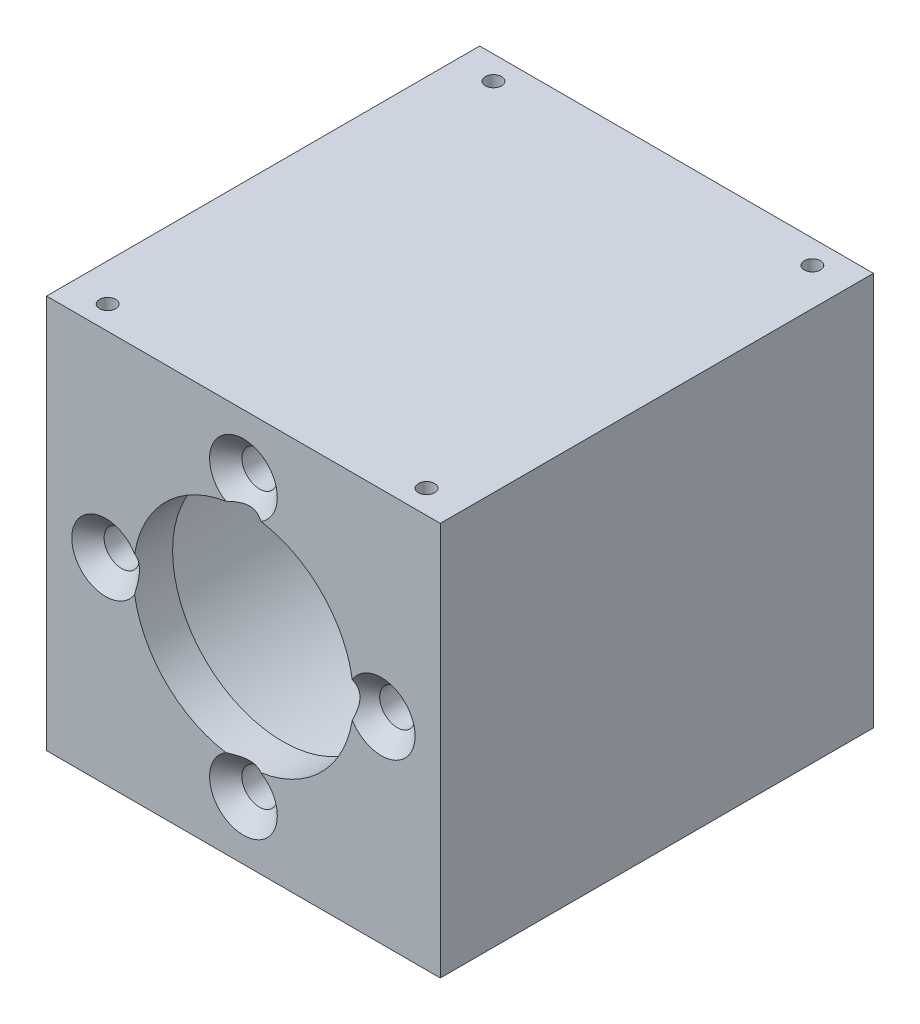
ISO-10303-21;
HEADER;
FILE_DESCRIPTION(('STEP AP214'),'2;1');
FILE_NAME('part.step','',(''),(''),'','','');
FILE_SCHEMA(('AUTOMOTIVE_DESIGN { 1 0 10303 214 1 1 1 1 }'));
ENDSEC;
DATA;
#1=APPLICATION_CONTEXT('core data for automotive mechanical design processes');
#2=APPLICATION_PROTOCOL_DEFINITION('international standard','automotive_design',2000,#1);
#3=PRODUCT_CONTEXT('',#1,'mechanical');
#4=PRODUCT('Part','Part','',(#3));
#5=PRODUCT_RELATED_PRODUCT_CATEGORY('part','',(#4));
#6=PRODUCT_DEFINITION_FORMATION('','',#4);
#7=PRODUCT_DEFINITION_CONTEXT('part definition',#1,'design');
#8=PRODUCT_DEFINITION('design','',#6,#7);
#9=PRODUCT_DEFINITION_SHAPE('','',#8);
#10=(LENGTH_UNIT() NAMED_UNIT(*) SI_UNIT(.MILLI.,.METRE.));
#11=(NAMED_UNIT(*) PLANE_ANGLE_UNIT() SI_UNIT($,.RADIAN.));
#12=(NAMED_UNIT(*) SI_UNIT($,.STERADIAN.) SOLID_ANGLE_UNIT());
#13=UNCERTAINTY_MEASURE_WITH_UNIT(LENGTH_MEASURE(1.E-05),#10,'distance_accuracy_value','');
#14=(GEOMETRIC_REPRESENTATION_CONTEXT(3) GLOBAL_UNCERTAINTY_ASSIGNED_CONTEXT((#13)) GLOBAL_UNIT_ASSIGNED_CONTEXT((#10,
#11,#12)) REPRESENTATION_CONTEXT('',''));
#15=CARTESIAN_POINT('',(0.,0.,0.));
#16=DIRECTION('',(0.,0.,1.));
#17=DIRECTION('',(1.,0.,0.));
#18=AXIS2_PLACEMENT_3D('',#15,#16,#17);
#19=CARTESIAN_POINT('',(0.,0.,27.5));
#20=DIRECTION('',(0.,0.,-1.));
#21=DIRECTION('',(-1.,0.,0.));
#22=AXIS2_PLACEMENT_3D('',#19,#20,#21);
#23=PLANE('',#22);
#24=DIRECTION('',(0.,1.,0.));
#25=VECTOR('',#24,1.);
#26=CARTESIAN_POINT('',(25.,-25.,27.5));
#27=LINE('',#26,#25);
#28=CARTESIAN_POINT('',(25.,-25.,27.5));
#29=VERTEX_POINT('',#28);
#30=CARTESIAN_POINT('',(25.,25.,27.5));
#31=VERTEX_POINT('',#30);
#32=EDGE_CURVE('E264',#29,#31,#27,.T.);
#33=ORIENTED_EDGE('',*,*,#32,.T.);
#34=DIRECTION('',(-1.,0.,0.));
#35=VECTOR('',#34,1.);
#36=CARTESIAN_POINT('',(-25.,25.,27.5));
#37=LINE('',#36,#35);
#38=CARTESIAN_POINT('',(-25.,25.,27.5));
#39=VERTEX_POINT('',#38);
#40=EDGE_CURVE('E267',#31,#39,#37,.T.);
#41=ORIENTED_EDGE('',*,*,#40,.T.);
#42=DIRECTION('',(0.,-1.,0.));
#43=VECTOR('',#42,1.);
#44=CARTESIAN_POINT('',(-25.,-25.,27.5));
#45=LINE('',#44,#43);
#46=CARTESIAN_POINT('',(-25.,-25.,27.5));
#47=VERTEX_POINT('',#46);
#48=EDGE_CURVE('E270',#39,#47,#45,.T.);
#49=ORIENTED_EDGE('',*,*,#48,.T.);
#50=DIRECTION('',(1.,0.,0.));
#51=VECTOR('',#50,1.);
#52=CARTESIAN_POINT('',(-25.,-25.,27.5));
#53=LINE('',#52,#51);
#54=EDGE_CURVE('E272',#47,#29,#53,.T.);
#55=ORIENTED_EDGE('',*,*,#54,.T.);
#56=EDGE_LOOP('',(#33,#41,#49,#55));
#57=FACE_BOUND('',#56,.T.);
#58=CARTESIAN_POINT('',(0.,17.5,27.5));
#59=DIRECTION('',(0.,0.,1.));
#60=DIRECTION('',(1.,0.,0.));
#61=AXIS2_PLACEMENT_3D('',#58,#59,#60);
#62=CIRCLE('',#61,4.3);
#63=CARTESIAN_POINT('',(2.22715383484878,13.8217142857143,27.5));
#64=VERTEX_POINT('',#63);
#65=CARTESIAN_POINT('',(-2.22715383484878,13.8217142857143,27.5));
#66=VERTEX_POINT('',#65);
#67=EDGE_CURVE('E91',#64,#66,#62,.T.);
#68=ORIENTED_EDGE('',*,*,#67,.F.);
#69=CARTESIAN_POINT('',(0.,0.,27.5));
#70=DIRECTION('',(0.,0.,1.));
#71=DIRECTION('',(1.,0.,0.));
#72=AXIS2_PLACEMENT_3D('',#69,#70,#71);
#73=CIRCLE('',#72,14.);
#74=CARTESIAN_POINT('',(13.8217142857143,2.22715383484877,27.5));
#75=VERTEX_POINT('',#74);
#76=EDGE_CURVE('E688',#75,#64,#73,.T.);
#77=ORIENTED_EDGE('',*,*,#76,.F.);
#78=CARTESIAN_POINT('',(17.5,0.,27.5));
#79=DIRECTION('',(0.,0.,1.));
#80=DIRECTION('',(1.,0.,0.));
#81=AXIS2_PLACEMENT_3D('',#78,#79,#80);
#82=CIRCLE('',#81,4.3);
#83=CARTESIAN_POINT('',(13.8217142857143,-2.22715383484878,27.5));
#84=VERTEX_POINT('',#83);
#85=EDGE_CURVE('E98',#84,#75,#82,.T.);
#86=ORIENTED_EDGE('',*,*,#85,.F.);
#87=CARTESIAN_POINT('',(2.22715383484878,-13.8217142857143,27.5));
#88=VERTEX_POINT('',#87);
#89=EDGE_CURVE('E262',#88,#84,#73,.T.);
#90=ORIENTED_EDGE('',*,*,#89,.F.);
#91=CARTESIAN_POINT('',(0.,-17.5,27.5));
#92=DIRECTION('',(0.,0.,1.));
#93=DIRECTION('',(1.,0.,0.));
#94=AXIS2_PLACEMENT_3D('',#91,#92,#93);
#95=CIRCLE('',#94,4.3);
#96=CARTESIAN_POINT('',(-2.22715383484878,-13.8217142857143,27.5));
#97=VERTEX_POINT('',#96);
#98=EDGE_CURVE('E211',#97,#88,#95,.T.);
#99=ORIENTED_EDGE('',*,*,#98,.F.);
#100=CARTESIAN_POINT('',(-13.8217142857143,-2.22715383484878,27.5));
#101=VERTEX_POINT('',#100);
#102=EDGE_CURVE('E258',#101,#97,#73,.T.);
#103=ORIENTED_EDGE('',*,*,#102,.F.);
#104=CARTESIAN_POINT('',(-17.5,0.,27.5));
#105=DIRECTION('',(0.,0.,1.));
#106=DIRECTION('',(1.,0.,0.));
#107=AXIS2_PLACEMENT_3D('',#104,#105,#106);
#108=CIRCLE('',#107,4.3);
#109=CARTESIAN_POINT('',(-13.8217142857143,2.22715383484878,27.5));
#110=VERTEX_POINT('',#109);
#111=EDGE_CURVE('E219',#110,#101,#108,.T.);
#112=ORIENTED_EDGE('',*,*,#111,.F.);
#113=EDGE_CURVE('E263',#66,#110,#73,.T.);
#114=ORIENTED_EDGE('',*,*,#113,.F.);
#115=EDGE_LOOP('',(#68,#77,#86,#90,#99,#103,#112,#114));
#116=FACE_BOUND('',#115,.T.);
#117=ADVANCED_FACE('F73',(#57,#116),#23,.F.);
#118=CARTESIAN_POINT('',(0.,0.,27.5));
#119=DIRECTION('',(0.,0.,-1.));
#120=DIRECTION('',(-1.,0.,0.));
#121=AXIS2_PLACEMENT_3D('',#118,#119,#120);
#122=CYLINDRICAL_SURFACE('',#121,14.);
#123=CARTESIAN_POINT('',(-2.22745880103771,13.8216651417143,27.5002));
#124=CARTESIAN_POINT('',(-2.17450267195315,13.8301988409129,27.4654729911263));
#125=CARTESIAN_POINT('',(-2.12113362184145,13.838487981573,27.4313171313179));
#126=CARTESIAN_POINT('',(-2.01348576873865,13.854560288671,27.3643139397824));
#127=CARTESIAN_POINT('',(-1.95920672173003,13.8623433165731,27.3314669672753));
#128=CARTESIAN_POINT('',(-1.79444409633277,13.884966802318,27.2348865725409));
#129=CARTESIAN_POINT('',(-1.68249632642925,13.8990067709712,27.1734201185765));
#130=CARTESIAN_POINT('',(-1.45191250125242,13.9250024136204,27.0572477027898));
#131=CARTESIAN_POINT('',(-1.33318581836051,13.9369087329985,27.0027086972848));
#132=CARTESIAN_POINT('',(-1.09115905950614,13.957939394927,26.9046630812547));
#133=CARTESIAN_POINT('',(-0.96786790802613,13.967068874707,26.861136123558));
#134=CARTESIAN_POINT('',(-0.762931476370636,13.9794236389379,26.8014873300983));
#135=CARTESIAN_POINT('',(-0.682561875823928,13.9835868705551,26.7811661442487));
#136=CARTESIAN_POINT('',(-0.520386819044165,13.9905603807477,26.7469256346802));
#137=CARTESIAN_POINT('',(-0.438581311626124,13.9933706109915,26.7330065396562));
#138=CARTESIAN_POINT('',(-0.274831076277266,13.9975394032496,26.7122967881537));
#139=CARTESIAN_POINT('',(-0.192895358088177,13.9989117514227,26.7054384457219));
#140=CARTESIAN_POINT('',(-0.0287273210955786,14.0002111524851,26.6989456618487));
#141=CARTESIAN_POINT('',(0.0535049815008426,14.000138283188,26.6993108314781));
#142=CARTESIAN_POINT('',(0.217607134094292,13.9985491542739,26.7072489076269));
#143=CARTESIAN_POINT('',(0.299476974674637,13.9970328573755,26.7148220003155));
#144=CARTESIAN_POINT('',(0.462237666722219,13.9926043465483,26.7368016229928));
#145=CARTESIAN_POINT('',(0.543128432987735,13.9896920120151,26.7512087433746));
#146=CARTESIAN_POINT('',(0.785113096769745,13.9789044903567,26.8041088517993));
#147=CARTESIAN_POINT('',(0.944071029492941,13.9689947124549,26.8521936803851));
#148=CARTESIAN_POINT('',(1.20015087805801,13.9488342648143,26.9472918899536));
#149=CARTESIAN_POINT('',(1.29953956583022,13.9399025943491,26.9888537275451));
#150=CARTESIAN_POINT('',(1.49525723898197,13.9202680942927,27.0784829548433));
#151=CARTESIAN_POINT('',(1.59158391043927,13.9095639615021,27.1265551264888));
#152=CARTESIAN_POINT('',(1.77935250765603,13.8867809536507,27.2267999762324));
#153=CARTESIAN_POINT('',(1.87085376850834,13.8747341587205,27.2788704005702));
#154=CARTESIAN_POINT('',(2.05109927537821,13.8492317295261,27.3868653601595));
#155=CARTESIAN_POINT('',(2.13984882602945,13.8357790568541,27.4427817119294));
#156=CARTESIAN_POINT('',(2.22745880103768,13.8216651417143,27.5002));
#157=B_SPLINE_CURVE_WITH_KNOTS('',3,(#123,#124,#125,#126,#127,#128,#129,#130,#131,#132,#133,
#134,#135,#136,#137,#138,#139,#140,#141,#142,#143,#144,#145,#146,#147,#148,#149,#150,#151,#152,
#153,#154,#155,#156),.UNSPECIFIED.,.F.,.F.,(4,2,2,2,2,2,2,2,2,2,2,2,2,2,2,2,4),(0.,
0.191689711953625,0.383431675211452,0.768589902940578,1.16174888862305,1.55417603224038,
1.80295482789635,2.05174250971589,2.29812240118427,2.54448902707525,2.7908620163931,
3.03725629380246,3.5343448819431,3.85842911793801,4.18275270299738,4.50053525074928,
4.81766136649085),.UNSPECIFIED.);
#158=EDGE_CURVE('E15',#66,#64,#157,.T.);
#159=ORIENTED_EDGE('',*,*,#158,.F.);
#160=ORIENTED_EDGE('',*,*,#113,.T.);
#161=CARTESIAN_POINT('',(-13.8216651417143,-2.22745880103771,27.5002));
#162=CARTESIAN_POINT('',(-13.8301988409129,-2.17450267195315,27.4654729911263));
#163=CARTESIAN_POINT('',(-13.838487981573,-2.12113362184145,27.4313171313179));
#164=CARTESIAN_POINT('',(-13.854560288671,-2.01348576873865,27.3643139397824));
#165=CARTESIAN_POINT('',(-13.8623433165731,-1.95920672173003,27.3314669672753));
#166=CARTESIAN_POINT('',(-13.884966802318,-1.79444409633277,27.2348865725409));
#167=CARTESIAN_POINT('',(-13.8990067709712,-1.68249632642925,27.1734201185765));
#168=CARTESIAN_POINT('',(-13.9250024136204,-1.45191250125242,27.0572477027898));
#169=CARTESIAN_POINT('',(-13.9369087329985,-1.33318581836051,27.0027086972848));
#170=CARTESIAN_POINT('',(-13.957939394927,-1.09115905950614,26.9046630812547));
#171=CARTESIAN_POINT('',(-13.967068874707,-0.967867908026133,26.861136123558));
#172=CARTESIAN_POINT('',(-13.9794236389379,-0.762931476370638,26.8014873300983));
#173=CARTESIAN_POINT('',(-13.9835868705551,-0.682561875823931,26.7811661442487));
#174=CARTESIAN_POINT('',(-13.9905603807477,-0.520386819044167,26.7469256346802));
#175=CARTESIAN_POINT('',(-13.9933706109915,-0.438581311626127,26.7330065396562));
#176=CARTESIAN_POINT('',(-13.9975394032496,-0.274831076277269,26.7122967881537));
#177=CARTESIAN_POINT('',(-13.9989117514227,-0.19289535808818,26.7054384457219));
#178=CARTESIAN_POINT('',(-14.0002111524851,-0.0287273210955819,26.6989456618487));
#179=CARTESIAN_POINT('',(-14.000138283188,0.0535049815008392,26.6993108314781));
#180=CARTESIAN_POINT('',(-13.9985491542739,0.217607134094288,26.7072489076269));
#181=CARTESIAN_POINT('',(-13.9970328573755,0.299476974674633,26.7148220003155));
#182=CARTESIAN_POINT('',(-13.9926043465483,0.462237666722216,26.7368016229928));
#183=CARTESIAN_POINT('',(-13.9896920120151,0.543128432987732,26.7512087433746));
#184=CARTESIAN_POINT('',(-13.9789044903567,0.785113096769742,26.8041088517993));
#185=CARTESIAN_POINT('',(-13.9689947124549,0.944071029492938,26.8521936803851));
#186=CARTESIAN_POINT('',(-13.9488342648143,1.20015087805801,26.9472918899536));
#187=CARTESIAN_POINT('',(-13.9399025943491,1.29953956583022,26.9888537275451));
#188=CARTESIAN_POINT('',(-13.9202680942927,1.49525723898197,27.0784829548433));
#189=CARTESIAN_POINT('',(-13.9095639615021,1.59158391043927,27.1265551264888));
#190=CARTESIAN_POINT('',(-13.8867809536507,1.77935250765603,27.2267999762324));
#191=CARTESIAN_POINT('',(-13.8747341587205,1.87085376850834,27.2788704005702));
#192=CARTESIAN_POINT('',(-13.8492317295261,2.05109927537822,27.3868653601595));
#193=CARTESIAN_POINT('',(-13.8357790568541,2.13984882602946,27.4427817119294));
#194=CARTESIAN_POINT('',(-13.8216651417143,2.22745880103768,27.5002));
#195=B_SPLINE_CURVE_WITH_KNOTS('',3,(#161,#162,#163,#164,#165,#166,#167,#168,#169,#170,#171,
#172,#173,#174,#175,#176,#177,#178,#179,#180,#181,#182,#183,#184,#185,#186,#187,#188,#189,#190,
#191,#192,#193,#194),.UNSPECIFIED.,.F.,.F.,(4,2,2,2,2,2,2,2,2,2,2,2,2,2,2,2,4),(0.,
0.191689711953621,0.383431675211451,0.768589902940576,1.16174888862304,1.55417603224037,
1.80295482789634,2.05174250971588,2.29812240118427,2.54448902707525,2.79086201639309,
3.03725629380245,3.53434488194309,3.85842911793801,4.18275270299738,4.50053525074928,
4.81766136649085),.UNSPECIFIED.);
#196=EDGE_CURVE('E293',#101,#110,#195,.T.);
#197=ORIENTED_EDGE('',*,*,#196,.F.);
#198=ORIENTED_EDGE('',*,*,#102,.T.);
#199=CARTESIAN_POINT('',(2.22745880103768,-13.8216651417143,27.5002));
#200=CARTESIAN_POINT('',(2.17450267195312,-13.8301988409129,27.4654729911263));
#201=CARTESIAN_POINT('',(2.12113362184142,-13.8384879815731,27.4313171313178));
#202=CARTESIAN_POINT('',(2.01348576873862,-13.854560288671,27.3643139397824));
#203=CARTESIAN_POINT('',(1.95920672173,-13.8623433165731,27.3314669672753));
#204=CARTESIAN_POINT('',(1.79444409633274,-13.884966802318,27.2348865725409));
#205=CARTESIAN_POINT('',(1.68249632642922,-13.8990067709712,27.1734201185764));
#206=CARTESIAN_POINT('',(1.45191250125239,-13.9250024136204,27.0572477027898));
#207=CARTESIAN_POINT('',(1.33318581836048,-13.9369087329985,27.0027086972848));
#208=CARTESIAN_POINT('',(1.09115905950611,-13.957939394927,26.9046630812546));
#209=CARTESIAN_POINT('',(0.967867908026108,-13.967068874707,26.861136123558));
#210=CARTESIAN_POINT('',(0.762931476370616,-13.9794236389379,26.8014873300983));
#211=CARTESIAN_POINT('',(0.682561875823909,-13.9835868705551,26.7811661442487));
#212=CARTESIAN_POINT('',(0.520386819044145,-13.9905603807477,26.7469256346802));
#213=CARTESIAN_POINT('',(0.438581311626104,-13.9933706109915,26.7330065396562));
#214=CARTESIAN_POINT('',(0.274831076277246,-13.9975394032496,26.7122967881537));
#215=CARTESIAN_POINT('',(0.192895358088158,-13.9989117514227,26.7054384457219));
#216=CARTESIAN_POINT('',(0.02872732109556,-14.0002111524851,26.6989456618487));
#217=CARTESIAN_POINT('',(-0.0535049815008611,-14.000138283188,26.6993108314781));
#218=CARTESIAN_POINT('',(-0.21760713409431,-13.9985491542739,26.7072489076269));
#219=CARTESIAN_POINT('',(-0.299476974674654,-13.9970328573755,26.7148220003155));
#220=CARTESIAN_POINT('',(-0.462237666722236,-13.9926043465483,26.7368016229928));
#221=CARTESIAN_POINT('',(-0.543128432987752,-13.9896920120151,26.7512087433746));
#222=CARTESIAN_POINT('',(-0.785113096769761,-13.9789044903567,26.8041088517993));
#223=CARTESIAN_POINT('',(-0.944071029492957,-13.9689947124549,26.8521936803851));
#224=CARTESIAN_POINT('',(-1.20015087805803,-13.9488342648143,26.9472918899536));
#225=CARTESIAN_POINT('',(-1.29953956583023,-13.9399025943491,26.9888537275451));
#226=CARTESIAN_POINT('',(-1.49525723898199,-13.9202680942927,27.0784829548433));
#227=CARTESIAN_POINT('',(-1.59158391043929,-13.9095639615021,27.1265551264888));
#228=CARTESIAN_POINT('',(-1.77935250765605,-13.8867809536507,27.2267999762324));
#229=CARTESIAN_POINT('',(-1.87085376850836,-13.8747341587205,27.2788704005703));
#230=CARTESIAN_POINT('',(-2.05109927537824,-13.8492317295261,27.3868653601595));
#231=CARTESIAN_POINT('',(-2.13984882602948,-13.8357790568541,27.4427817119294));
#232=CARTESIAN_POINT('',(-2.2274588010377,-13.8216651417143,27.5002));
#233=B_SPLINE_CURVE_WITH_KNOTS('',3,(#199,#200,#201,#202,#203,#204,#205,#206,#207,#208,#209,
#210,#211,#212,#213,#214,#215,#216,#217,#218,#219,#220,#221,#222,#223,#224,#225,#226,#227,#228,
#229,#230,#231,#232),.UNSPECIFIED.,.F.,.F.,(4,2,2,2,2,2,2,2,2,2,2,2,2,2,2,2,4),(0.,
0.191689711953622,0.383431675211452,0.768589902940573,1.16174888862304,1.55417603224036,
1.80295482789633,2.05174250971587,2.29812240118426,2.54448902707523,2.79086201639308,
3.03725629380244,3.53434488194308,3.85842911793799,4.18275270299737,4.50053525074928,
4.81766136649085),.UNSPECIFIED.);
#234=EDGE_CURVE('E302',#88,#97,#233,.T.);
#235=ORIENTED_EDGE('',*,*,#234,.F.);
#236=ORIENTED_EDGE('',*,*,#89,.T.);
#237=CARTESIAN_POINT('',(13.8216651417143,2.22745880103768,27.5002));
#238=CARTESIAN_POINT('',(13.8301988409129,2.17450267195312,27.4654729911263));
#239=CARTESIAN_POINT('',(13.8384879815731,2.12113362184142,27.4313171313178));
#240=CARTESIAN_POINT('',(13.854560288671,2.01348576873862,27.3643139397824));
#241=CARTESIAN_POINT('',(13.8623433165731,1.95920672173,27.3314669672753));
#242=CARTESIAN_POINT('',(13.884966802318,1.79444409633274,27.2348865725409));
#243=CARTESIAN_POINT('',(13.8990067709712,1.68249632642922,27.1734201185764));
#244=CARTESIAN_POINT('',(13.9250024136204,1.4519125012524,27.0572477027898));
#245=CARTESIAN_POINT('',(13.9369087329985,1.33318581836049,27.0027086972848));
#246=CARTESIAN_POINT('',(13.957939394927,1.09115905950611,26.9046630812547));
#247=CARTESIAN_POINT('',(13.967068874707,0.96786790802611,26.861136123558));
#248=CARTESIAN_POINT('',(13.9794236389379,0.762931476370618,26.8014873300983));
#249=CARTESIAN_POINT('',(13.9835868705551,0.68256187582391,26.7811661442487));
#250=CARTESIAN_POINT('',(13.9905603807477,0.520386819044147,26.7469256346802));
#251=CARTESIAN_POINT('',(13.9933706109915,0.438581311626107,26.7330065396562));
#252=CARTESIAN_POINT('',(13.9975394032496,0.274831076277249,26.7122967881537));
#253=CARTESIAN_POINT('',(13.9989117514227,0.19289535808816,26.7054384457219));
#254=CARTESIAN_POINT('',(14.0002111524851,0.028727321095563,26.6989456618487));
#255=CARTESIAN_POINT('',(14.000138283188,-0.0535049815008578,26.6993108314781));
#256=CARTESIAN_POINT('',(13.9985491542739,-0.217607134094306,26.7072489076269));
#257=CARTESIAN_POINT('',(13.9970328573755,-0.299476974674651,26.7148220003155));
#258=CARTESIAN_POINT('',(13.9926043465483,-0.462237666722232,26.7368016229928));
#259=CARTESIAN_POINT('',(13.9896920120151,-0.543128432987747,26.7512087433746));
#260=CARTESIAN_POINT('',(13.9789044903567,-0.785113096769756,26.8041088517993));
#261=CARTESIAN_POINT('',(13.9689947124549,-0.944071029492952,26.8521936803851));
#262=CARTESIAN_POINT('',(13.9488342648143,-1.20015087805802,26.9472918899536));
#263=CARTESIAN_POINT('',(13.9399025943491,-1.29953956583023,26.9888537275451));
#264=CARTESIAN_POINT('',(13.9202680942927,-1.49525723898199,27.0784829548433));
#265=CARTESIAN_POINT('',(13.9095639615021,-1.59158391043929,27.1265551264888));
#266=CARTESIAN_POINT('',(13.8867809536507,-1.77935250765605,27.2267999762324));
#267=CARTESIAN_POINT('',(13.8747341587205,-1.87085376850836,27.2788704005703));
#268=CARTESIAN_POINT('',(13.8492317295261,-2.05109927537824,27.3868653601595));
#269=CARTESIAN_POINT('',(13.8357790568541,-2.13984882602948,27.4427817119294));
#270=CARTESIAN_POINT('',(13.8216651417143,-2.2274588010377,27.5002));
#271=B_SPLINE_CURVE_WITH_KNOTS('',3,(#237,#238,#239,#240,#241,#242,#243,#244,#245,#246,#247,
#248,#249,#250,#251,#252,#253,#254,#255,#256,#257,#258,#259,#260,#261,#262,#263,#264,#265,#266,
#267,#268,#269,#270),.UNSPECIFIED.,.F.,.F.,(4,2,2,2,2,2,2,2,2,2,2,2,2,2,2,2,4),(0.,
0.19168971195362,0.383431675211449,0.768589902940568,1.16174888862303,1.55417603224036,
1.80295482789633,2.05174250971587,2.29812240118425,2.54448902707523,2.79086201639307,
3.03725629380243,3.53434488194307,3.85842911793799,4.18275270299736,4.50053525074927,
4.81766136649085),.UNSPECIFIED.);
#272=EDGE_CURVE('E86',#75,#84,#271,.T.);
#273=ORIENTED_EDGE('',*,*,#272,.F.);
#274=ORIENTED_EDGE('',*,*,#76,.T.);
#275=EDGE_LOOP('',(#159,#160,#197,#198,#235,#236,#273,#274));
#276=FACE_BOUND('',#275,.T.);
#277=CARTESIAN_POINT('',(0.,0.,22.5));
#278=DIRECTION('',(0.,0.,-1.));
#279=DIRECTION('',(-1.,0.,0.));
#280=AXIS2_PLACEMENT_3D('',#277,#278,#279);
#281=CIRCLE('',#280,14.);
#282=CARTESIAN_POINT('',(-14.,0.,22.5));
#283=VERTEX_POINT('',#282);
#284=EDGE_CURVE('E257',#283,#283,#281,.T.);
#285=ORIENTED_EDGE('',*,*,#284,.T.);
#286=EDGE_LOOP('',(#285));
#287=FACE_BOUND('',#286,.T.);
#288=ADVANCED_FACE('F307',(#276,#287),#122,.F.);
#289=CARTESIAN_POINT('',(0.,0.,-27.5));
#290=DIRECTION('',(0.,0.,-1.));
#291=DIRECTION('',(-1.,0.,0.));
#292=AXIS2_PLACEMENT_3D('',#289,#290,#291);
#293=PLANE('',#292);
#294=CARTESIAN_POINT('',(0.,0.,-27.5));
#295=DIRECTION('',(0.,0.,-1.));
#296=DIRECTION('',(-1.,0.,0.));
#297=AXIS2_PLACEMENT_3D('',#294,#295,#296);
#298=CIRCLE('',#297,21.);
#299=CARTESIAN_POINT('',(-21.,0.,-27.5));
#300=VERTEX_POINT('',#299);
#301=EDGE_CURVE('E251',#300,#300,#298,.T.);
#302=ORIENTED_EDGE('',*,*,#301,.F.);
#303=EDGE_LOOP('',(#302));
#304=FACE_BOUND('',#303,.T.);
#305=DIRECTION('',(0.,1.,0.));
#306=VECTOR('',#305,1.);
#307=CARTESIAN_POINT('',(25.,-25.,-27.5));
#308=LINE('',#307,#306);
#309=CARTESIAN_POINT('',(25.,-25.,-27.5));
#310=VERTEX_POINT('',#309);
#311=CARTESIAN_POINT('',(25.,25.,-27.5));
#312=VERTEX_POINT('',#311);
#313=EDGE_CURVE('E261',#310,#312,#308,.T.);
#314=ORIENTED_EDGE('',*,*,#313,.F.);
#315=DIRECTION('',(1.,0.,0.));
#316=VECTOR('',#315,1.);
#317=CARTESIAN_POINT('',(-25.,-25.,-27.5));
#318=LINE('',#317,#316);
#319=CARTESIAN_POINT('',(-25.,-25.,-27.5));
#320=VERTEX_POINT('',#319);
#321=EDGE_CURVE('E268',#320,#310,#318,.T.);
#322=ORIENTED_EDGE('',*,*,#321,.F.);
#323=DIRECTION('',(0.,-1.,0.));
#324=VECTOR('',#323,1.);
#325=CARTESIAN_POINT('',(-25.,-25.,-27.5));
#326=LINE('',#325,#324);
#327=CARTESIAN_POINT('',(-25.,25.,-27.5));
#328=VERTEX_POINT('',#327);
#329=EDGE_CURVE('E279',#328,#320,#326,.T.);
#330=ORIENTED_EDGE('',*,*,#329,.F.);
#331=DIRECTION('',(-1.,0.,0.));
#332=VECTOR('',#331,1.);
#333=CARTESIAN_POINT('',(-25.,25.,-27.5));
#334=LINE('',#333,#332);
#335=EDGE_CURVE('E277',#312,#328,#334,.T.);
#336=ORIENTED_EDGE('',*,*,#335,.F.);
#337=EDGE_LOOP('',(#314,#322,#330,#336));
#338=FACE_BOUND('',#337,.T.);
#339=ADVANCED_FACE('F373',(#304,#338),#293,.T.);
#340=CARTESIAN_POINT('',(25.,-25.,27.5));
#341=DIRECTION('',(-1.,0.,0.));
#342=DIRECTION('',(0.,0.,1.));
#343=AXIS2_PLACEMENT_3D('',#340,#341,#342);
#344=PLANE('',#343);
#345=ORIENTED_EDGE('',*,*,#313,.T.);
#346=DIRECTION('',(0.,0.,-1.));
#347=VECTOR('',#346,1.);
#348=CARTESIAN_POINT('',(25.,25.,27.5));
#349=LINE('',#348,#347);
#350=EDGE_CURVE('E290',#31,#312,#349,.T.);
#351=ORIENTED_EDGE('',*,*,#350,.F.);
#352=ORIENTED_EDGE('',*,*,#32,.F.);
#353=DIRECTION('',(0.,0.,-1.));
#354=VECTOR('',#353,1.);
#355=CARTESIAN_POINT('',(25.,-25.,27.5));
#356=LINE('',#355,#354);
#357=EDGE_CURVE('E274',#29,#310,#356,.T.);
#358=ORIENTED_EDGE('',*,*,#357,.T.);
#359=EDGE_LOOP('',(#345,#351,#352,#358));
#360=FACE_BOUND('',#359,.T.);
#361=ADVANCED_FACE('F75',(#360),#344,.F.);
#362=CARTESIAN_POINT('',(-25.,25.,27.5));
#363=DIRECTION('',(0.,-1.,0.));
#364=DIRECTION('',(0.,0.,-1.));
#365=AXIS2_PLACEMENT_3D('',#362,#363,#364);
#366=PLANE('',#365);
#367=CARTESIAN_POINT('',(20.25,25.,-24.5));
#368=DIRECTION('',(0.,1.,0.));
#369=DIRECTION('',(0.,0.,1.));
#370=AXIS2_PLACEMENT_3D('',#367,#368,#369);
#371=CIRCLE('',#370,1.02499999999999);
#372=CARTESIAN_POINT('',(20.25,25.,-23.475));
#373=VERTEX_POINT('',#372);
#374=EDGE_CURVE('E227',#373,#373,#371,.T.);
#375=ORIENTED_EDGE('',*,*,#374,.F.);
#376=EDGE_LOOP('',(#375));
#377=FACE_BOUND('',#376,.T.);
#378=CARTESIAN_POINT('',(-20.25,25.,24.5));
#379=DIRECTION('',(0.,1.,0.));
#380=DIRECTION('',(0.,0.,1.));
#381=AXIS2_PLACEMENT_3D('',#378,#379,#380);
#382=CIRCLE('',#381,1.02499999999999);
#383=CARTESIAN_POINT('',(-20.25,25.,25.525));
#384=VERTEX_POINT('',#383);
#385=EDGE_CURVE('E233',#384,#384,#382,.T.);
#386=ORIENTED_EDGE('',*,*,#385,.F.);
#387=EDGE_LOOP('',(#386));
#388=FACE_BOUND('',#387,.T.);
#389=CARTESIAN_POINT('',(-20.25,25.,-24.5));
#390=DIRECTION('',(0.,1.,0.));
#391=DIRECTION('',(0.,0.,1.));
#392=AXIS2_PLACEMENT_3D('',#389,#390,#391);
#393=CIRCLE('',#392,1.02499999999999);
#394=CARTESIAN_POINT('',(-20.25,25.,-23.475));
#395=VERTEX_POINT('',#394);
#396=EDGE_CURVE('E239',#395,#395,#393,.T.);
#397=ORIENTED_EDGE('',*,*,#396,.F.);
#398=EDGE_LOOP('',(#397));
#399=FACE_BOUND('',#398,.T.);
#400=CARTESIAN_POINT('',(20.25,25.,24.5));
#401=DIRECTION('',(0.,1.,0.));
#402=DIRECTION('',(0.,0.,1.));
#403=AXIS2_PLACEMENT_3D('',#400,#401,#402);
#404=CIRCLE('',#403,1.02499999999999);
#405=CARTESIAN_POINT('',(20.25,25.,25.525));
#406=VERTEX_POINT('',#405);
#407=EDGE_CURVE('E245',#406,#406,#404,.T.);
#408=ORIENTED_EDGE('',*,*,#407,.F.);
#409=EDGE_LOOP('',(#408));
#410=FACE_BOUND('',#409,.T.);
#411=ORIENTED_EDGE('',*,*,#335,.T.);
#412=DIRECTION('',(0.,0.,-1.));
#413=VECTOR('',#412,1.);
#414=CARTESIAN_POINT('',(-25.,25.,27.5));
#415=LINE('',#414,#413);
#416=EDGE_CURVE('E287',#39,#328,#415,.T.);
#417=ORIENTED_EDGE('',*,*,#416,.F.);
#418=ORIENTED_EDGE('',*,*,#40,.F.);
#419=ORIENTED_EDGE('',*,*,#350,.T.);
#420=EDGE_LOOP('',(#411,#417,#418,#419));
#421=FACE_BOUND('',#420,.T.);
#422=ADVANCED_FACE('F381',(#377,#388,#399,#410,#421),#366,.F.);
#423=CARTESIAN_POINT('',(-25.,-25.,27.5));
#424=DIRECTION('',(1.,0.,0.));
#425=DIRECTION('',(0.,0.,-1.));
#426=AXIS2_PLACEMENT_3D('',#423,#424,#425);
#427=PLANE('',#426);
#428=ORIENTED_EDGE('',*,*,#329,.T.);
#429=DIRECTION('',(0.,0.,-1.));
#430=VECTOR('',#429,1.);
#431=CARTESIAN_POINT('',(-25.,-25.,27.5));
#432=LINE('',#431,#430);
#433=EDGE_CURVE('E284',#47,#320,#432,.T.);
#434=ORIENTED_EDGE('',*,*,#433,.F.);
#435=ORIENTED_EDGE('',*,*,#48,.F.);
#436=ORIENTED_EDGE('',*,*,#416,.T.);
#437=EDGE_LOOP('',(#428,#434,#435,#436));
#438=FACE_BOUND('',#437,.T.);
#439=ADVANCED_FACE('F364',(#438),#427,.F.);
#440=CARTESIAN_POINT('',(-25.,-25.,27.5));
#441=DIRECTION('',(0.,1.,0.));
#442=DIRECTION('',(0.,0.,1.));
#443=AXIS2_PLACEMENT_3D('',#440,#441,#442);
#444=PLANE('',#443);
#445=CARTESIAN_POINT('',(-21.,-25.,23.5));
#446=DIRECTION('',(0.,-1.,0.));
#447=DIRECTION('',(0.,0.,-1.));
#448=AXIS2_PLACEMENT_3D('',#445,#446,#447);
#449=CIRCLE('',#448,1.64999999999999);
#450=CARTESIAN_POINT('',(-21.,-25.,21.85));
#451=VERTEX_POINT('',#450);
#452=EDGE_CURVE('E175',#451,#451,#449,.T.);
#453=ORIENTED_EDGE('',*,*,#452,.F.);
#454=EDGE_LOOP('',(#453));
#455=FACE_BOUND('',#454,.T.);
#456=CARTESIAN_POINT('',(21.,-25.,-23.5));
#457=DIRECTION('',(0.,-1.,0.));
#458=DIRECTION('',(0.,0.,-1.));
#459=AXIS2_PLACEMENT_3D('',#456,#457,#458);
#460=CIRCLE('',#459,1.64999999999999);
#461=CARTESIAN_POINT('',(21.,-25.,-25.15));
#462=VERTEX_POINT('',#461);
#463=EDGE_CURVE('E174',#462,#462,#460,.T.);
#464=ORIENTED_EDGE('',*,*,#463,.F.);
#465=EDGE_LOOP('',(#464));
#466=FACE_BOUND('',#465,.T.);
#467=CARTESIAN_POINT('',(-21.,-25.,-23.5));
#468=DIRECTION('',(0.,-1.,0.));
#469=DIRECTION('',(0.,0.,-1.));
#470=AXIS2_PLACEMENT_3D('',#467,#468,#469);
#471=CIRCLE('',#470,1.64999999999999);
#472=CARTESIAN_POINT('',(-21.,-25.,-25.15));
#473=VERTEX_POINT('',#472);
#474=EDGE_CURVE('E185',#473,#473,#471,.T.);
#475=ORIENTED_EDGE('',*,*,#474,.F.);
#476=EDGE_LOOP('',(#475));
#477=FACE_BOUND('',#476,.T.);
#478=CARTESIAN_POINT('',(21.,-25.,23.5));
#479=DIRECTION('',(0.,-1.,0.));
#480=DIRECTION('',(0.,0.,-1.));
#481=AXIS2_PLACEMENT_3D('',#478,#479,#480);
#482=CIRCLE('',#481,1.64999999999999);
#483=CARTESIAN_POINT('',(21.,-25.,21.85));
#484=VERTEX_POINT('',#483);
#485=EDGE_CURVE('E191',#484,#484,#482,.T.);
#486=ORIENTED_EDGE('',*,*,#485,.F.);
#487=EDGE_LOOP('',(#486));
#488=FACE_BOUND('',#487,.T.);
#489=ORIENTED_EDGE('',*,*,#321,.T.);
#490=ORIENTED_EDGE('',*,*,#357,.F.);
#491=ORIENTED_EDGE('',*,*,#54,.F.);
#492=ORIENTED_EDGE('',*,*,#433,.T.);
#493=EDGE_LOOP('',(#489,#490,#491,#492));
#494=FACE_BOUND('',#493,.T.);
#495=ADVANCED_FACE('F359',(#455,#466,#477,#488,#494),#444,.F.);
#496=CARTESIAN_POINT('',(0.,0.,86.89696961967));
#497=DIRECTION('',(0.,0.,-1.));
#498=DIRECTION('',(-1.,0.,0.));
#499=AXIS2_PLACEMENT_3D('',#496,#497,#498);
#500=CYLINDRICAL_SURFACE('',#499,21.);
#501=CARTESIAN_POINT('',(0.,0.,22.5));
#502=DIRECTION('',(0.,0.,-1.));
#503=DIRECTION('',(-1.,0.,0.));
#504=AXIS2_PLACEMENT_3D('',#501,#502,#503);
#505=CIRCLE('',#504,21.);
#506=CARTESIAN_POINT('',(-21.,0.,22.5));
#507=VERTEX_POINT('',#506);
#508=EDGE_CURVE('E254',#507,#507,#505,.F.);
#509=ORIENTED_EDGE('',*,*,#508,.T.);
#510=EDGE_LOOP('',(#509));
#511=FACE_BOUND('',#510,.T.);
#512=ORIENTED_EDGE('',*,*,#301,.T.);
#513=EDGE_LOOP('',(#512));
#514=FACE_BOUND('',#513,.T.);
#515=ADVANCED_FACE('F356',(#511,#514),#500,.F.);
#516=CARTESIAN_POINT('',(0.,0.,22.5));
#517=DIRECTION('',(0.,0.,-1.));
#518=DIRECTION('',(-1.,0.,0.));
#519=AXIS2_PLACEMENT_3D('',#516,#517,#518);
#520=PLANE('',#519);
#521=CARTESIAN_POINT('',(0.,17.5,22.5));
#522=DIRECTION('',(0.,0.,-1.));
#523=DIRECTION('',(-1.,0.,0.));
#524=AXIS2_PLACEMENT_3D('',#521,#522,#523);
#525=CIRCLE('',#524,2.25);
#526=CARTESIAN_POINT('',(-2.25,17.5,22.5));
#527=VERTEX_POINT('',#526);
#528=EDGE_CURVE('E201',#527,#527,#525,.T.);
#529=ORIENTED_EDGE('',*,*,#528,.F.);
#530=EDGE_LOOP('',(#529));
#531=FACE_BOUND('',#530,.T.);
#532=CARTESIAN_POINT('',(17.5,0.,22.5));
#533=DIRECTION('',(0.,0.,-1.));
#534=DIRECTION('',(-1.,0.,0.));
#535=AXIS2_PLACEMENT_3D('',#532,#533,#534);
#536=CIRCLE('',#535,2.25);
#537=CARTESIAN_POINT('',(15.25,0.,22.5));
#538=VERTEX_POINT('',#537);
#539=EDGE_CURVE('E208',#538,#538,#536,.T.);
#540=ORIENTED_EDGE('',*,*,#539,.F.);
#541=EDGE_LOOP('',(#540));
#542=FACE_BOUND('',#541,.T.);
#543=CARTESIAN_POINT('',(0.,-17.5,22.5));
#544=DIRECTION('',(0.,0.,-1.));
#545=DIRECTION('',(-1.,0.,0.));
#546=AXIS2_PLACEMENT_3D('',#543,#544,#545);
#547=CIRCLE('',#546,2.25);
#548=CARTESIAN_POINT('',(-2.25,-17.5,22.5));
#549=VERTEX_POINT('',#548);
#550=EDGE_CURVE('E216',#549,#549,#547,.T.);
#551=ORIENTED_EDGE('',*,*,#550,.F.);
#552=EDGE_LOOP('',(#551));
#553=FACE_BOUND('',#552,.T.);
#554=CARTESIAN_POINT('',(-17.5,0.,22.5));
#555=DIRECTION('',(0.,0.,-1.));
#556=DIRECTION('',(-1.,0.,0.));
#557=AXIS2_PLACEMENT_3D('',#554,#555,#556);
#558=CIRCLE('',#557,2.25);
#559=CARTESIAN_POINT('',(-19.75,0.,22.5));
#560=VERTEX_POINT('',#559);
#561=EDGE_CURVE('E224',#560,#560,#558,.T.);
#562=ORIENTED_EDGE('',*,*,#561,.F.);
#563=EDGE_LOOP('',(#562));
#564=FACE_BOUND('',#563,.T.);
#565=ORIENTED_EDGE('',*,*,#284,.F.);
#566=EDGE_LOOP('',(#565));
#567=FACE_BOUND('',#566,.T.);
#568=ORIENTED_EDGE('',*,*,#508,.F.);
#569=EDGE_LOOP('',(#568));
#570=FACE_BOUND('',#569,.T.);
#571=ADVANCED_FACE('F353',(#531,#542,#553,#564,#567,#570),#520,.T.);
#572=CARTESIAN_POINT('',(20.25,17.75,24.5));
#573=DIRECTION('',(0.,1.,0.));
#574=DIRECTION('',(0.,0.,1.));
#575=AXIS2_PLACEMENT_3D('',#572,#573,#574);
#576=CONICAL_SURFACE('',#575,1.02499999999999,1.02974425867665);
#577=CARTESIAN_POINT('',(20.25,17.1341178654968,24.5));
#578=VERTEX_POINT('',#577);
#579=VERTEX_LOOP('',#578);
#580=FACE_BOUND('',#579,.T.);
#581=CARTESIAN_POINT('',(20.25,17.75,24.5));
#582=DIRECTION('',(0.,1.,0.));
#583=DIRECTION('',(0.,0.,1.));
#584=AXIS2_PLACEMENT_3D('',#581,#582,#583);
#585=CIRCLE('',#584,1.02499999999999);
#586=CARTESIAN_POINT('',(20.25,17.75,25.525));
#587=VERTEX_POINT('',#586);
#588=EDGE_CURVE('E248',#587,#587,#585,.T.);
#589=ORIENTED_EDGE('',*,*,#588,.T.);
#590=EDGE_LOOP('',(#589));
#591=FACE_BOUND('',#590,.T.);
#592=ADVANCED_FACE('F349',(#580,#591),#576,.F.);
#593=CARTESIAN_POINT('',(20.25,25.,24.5));
#594=DIRECTION('',(0.,1.,0.));
#595=DIRECTION('',(0.,0.,1.));
#596=AXIS2_PLACEMENT_3D('',#593,#594,#595);
#597=CYLINDRICAL_SURFACE('',#596,1.02499999999999);
#598=ORIENTED_EDGE('',*,*,#588,.F.);
#599=EDGE_LOOP('',(#598));
#600=FACE_BOUND('',#599,.T.);
#601=ORIENTED_EDGE('',*,*,#407,.T.);
#602=EDGE_LOOP('',(#601));
#603=FACE_BOUND('',#602,.T.);
#604=ADVANCED_FACE('F345',(#600,#603),#597,.F.);
#605=CARTESIAN_POINT('',(-20.25,17.75,-24.5));
#606=DIRECTION('',(0.,1.,0.));
#607=DIRECTION('',(0.,0.,1.));
#608=AXIS2_PLACEMENT_3D('',#605,#606,#607);
#609=CONICAL_SURFACE('',#608,1.02499999999999,1.02974425867665);
#610=CARTESIAN_POINT('',(-20.25,17.1341178654968,-24.5));
#611=VERTEX_POINT('',#610);
#612=VERTEX_LOOP('',#611);
#613=FACE_BOUND('',#612,.T.);
#614=CARTESIAN_POINT('',(-20.25,17.75,-24.5));
#615=DIRECTION('',(0.,1.,0.));
#616=DIRECTION('',(0.,0.,1.));
#617=AXIS2_PLACEMENT_3D('',#614,#615,#616);
#618=CIRCLE('',#617,1.02499999999999);
#619=CARTESIAN_POINT('',(-20.25,17.75,-23.475));
#620=VERTEX_POINT('',#619);
#621=EDGE_CURVE('E242',#620,#620,#618,.T.);
#622=ORIENTED_EDGE('',*,*,#621,.T.);
#623=EDGE_LOOP('',(#622));
#624=FACE_BOUND('',#623,.T.);
#625=ADVANCED_FACE('F341',(#613,#624),#609,.F.);
#626=CARTESIAN_POINT('',(-20.25,25.,-24.5));
#627=DIRECTION('',(0.,1.,0.));
#628=DIRECTION('',(0.,0.,1.));
#629=AXIS2_PLACEMENT_3D('',#626,#627,#628);
#630=CYLINDRICAL_SURFACE('',#629,1.02499999999999);
#631=ORIENTED_EDGE('',*,*,#621,.F.);
#632=EDGE_LOOP('',(#631));
#633=FACE_BOUND('',#632,.T.);
#634=ORIENTED_EDGE('',*,*,#396,.T.);
#635=EDGE_LOOP('',(#634));
#636=FACE_BOUND('',#635,.T.);
#637=ADVANCED_FACE('F337',(#633,#636),#630,.F.);
#638=CARTESIAN_POINT('',(-20.25,17.75,24.5));
#639=DIRECTION('',(0.,1.,0.));
#640=DIRECTION('',(0.,0.,1.));
#641=AXIS2_PLACEMENT_3D('',#638,#639,#640);
#642=CONICAL_SURFACE('',#641,1.02499999999999,1.02974425867665);
#643=CARTESIAN_POINT('',(-20.25,17.1341178654968,24.5));
#644=VERTEX_POINT('',#643);
#645=VERTEX_LOOP('',#644);
#646=FACE_BOUND('',#645,.T.);
#647=CARTESIAN_POINT('',(-20.25,17.75,24.5));
#648=DIRECTION('',(0.,1.,0.));
#649=DIRECTION('',(0.,0.,1.));
#650=AXIS2_PLACEMENT_3D('',#647,#648,#649);
#651=CIRCLE('',#650,1.02499999999999);
#652=CARTESIAN_POINT('',(-20.25,17.75,25.525));
#653=VERTEX_POINT('',#652);
#654=EDGE_CURVE('E236',#653,#653,#651,.T.);
#655=ORIENTED_EDGE('',*,*,#654,.T.);
#656=EDGE_LOOP('',(#655));
#657=FACE_BOUND('',#656,.T.);
#658=ADVANCED_FACE('F333',(#646,#657),#642,.F.);
#659=CARTESIAN_POINT('',(-20.25,25.,24.5));
#660=DIRECTION('',(0.,1.,0.));
#661=DIRECTION('',(0.,0.,1.));
#662=AXIS2_PLACEMENT_3D('',#659,#660,#661);
#663=CYLINDRICAL_SURFACE('',#662,1.02499999999999);
#664=ORIENTED_EDGE('',*,*,#654,.F.);
#665=EDGE_LOOP('',(#664));
#666=FACE_BOUND('',#665,.T.);
#667=ORIENTED_EDGE('',*,*,#385,.T.);
#668=EDGE_LOOP('',(#667));
#669=FACE_BOUND('',#668,.T.);
#670=ADVANCED_FACE('F329',(#666,#669),#663,.F.);
#671=CARTESIAN_POINT('',(20.25,17.75,-24.5));
#672=DIRECTION('',(0.,1.,0.));
#673=DIRECTION('',(0.,0.,1.));
#674=AXIS2_PLACEMENT_3D('',#671,#672,#673);
#675=CONICAL_SURFACE('',#674,1.02499999999999,1.02974425867665);
#676=CARTESIAN_POINT('',(20.25,17.1341178654968,-24.5));
#677=VERTEX_POINT('',#676);
#678=VERTEX_LOOP('',#677);
#679=FACE_BOUND('',#678,.T.);
#680=CARTESIAN_POINT('',(20.25,17.75,-24.5));
#681=DIRECTION('',(0.,1.,0.));
#682=DIRECTION('',(0.,0.,1.));
#683=AXIS2_PLACEMENT_3D('',#680,#681,#682);
#684=CIRCLE('',#683,1.02499999999999);
#685=CARTESIAN_POINT('',(20.25,17.75,-23.475));
#686=VERTEX_POINT('',#685);
#687=EDGE_CURVE('E230',#686,#686,#684,.T.);
#688=ORIENTED_EDGE('',*,*,#687,.T.);
#689=EDGE_LOOP('',(#688));
#690=FACE_BOUND('',#689,.T.);
#691=ADVANCED_FACE('F325',(#679,#690),#675,.F.);
#692=CARTESIAN_POINT('',(20.25,25.,-24.5));
#693=DIRECTION('',(0.,1.,0.));
#694=DIRECTION('',(0.,0.,1.));
#695=AXIS2_PLACEMENT_3D('',#692,#693,#694);
#696=CYLINDRICAL_SURFACE('',#695,1.02499999999999);
#697=ORIENTED_EDGE('',*,*,#687,.F.);
#698=EDGE_LOOP('',(#697));
#699=FACE_BOUND('',#698,.T.);
#700=ORIENTED_EDGE('',*,*,#374,.T.);
#701=EDGE_LOOP('',(#700));
#702=FACE_BOUND('',#701,.T.);
#703=ADVANCED_FACE('F321',(#699,#702),#696,.F.);
#704=CARTESIAN_POINT('',(-17.5,0.,27.5));
#705=DIRECTION('',(0.,0.,1.));
#706=DIRECTION('',(1.,0.,0.));
#707=AXIS2_PLACEMENT_3D('',#704,#705,#706);
#708=CYLINDRICAL_SURFACE('',#707,2.25);
#709=CARTESIAN_POINT('',(-17.5,0.,25.45));
#710=DIRECTION('',(0.,0.,1.));
#711=DIRECTION('',(1.,0.,0.));
#712=AXIS2_PLACEMENT_3D('',#709,#710,#711);
#713=CIRCLE('',#712,2.25);
#714=CARTESIAN_POINT('',(-15.25,0.,25.45));
#715=VERTEX_POINT('',#714);
#716=EDGE_CURVE('E221',#715,#715,#713,.T.);
#717=ORIENTED_EDGE('',*,*,#716,.T.);
#718=EDGE_LOOP('',(#717));
#719=FACE_BOUND('',#718,.T.);
#720=ORIENTED_EDGE('',*,*,#561,.T.);
#721=EDGE_LOOP('',(#720));
#722=FACE_BOUND('',#721,.T.);
#723=ADVANCED_FACE('F317',(#719,#722),#708,.F.);
#724=CARTESIAN_POINT('',(-17.5,0.,27.5));
#725=DIRECTION('',(0.,0.,1.));
#726=DIRECTION('',(1.,0.,0.));
#727=AXIS2_PLACEMENT_3D('',#724,#725,#726);
#728=CONICAL_SURFACE('',#727,4.3,0.785398163397449);
#729=ORIENTED_EDGE('',*,*,#196,.T.);
#730=ORIENTED_EDGE('',*,*,#111,.T.);
#731=EDGE_LOOP('',(#729,#730));
#732=FACE_BOUND('',#731,.T.);
#733=ORIENTED_EDGE('',*,*,#716,.F.);
#734=EDGE_LOOP('',(#733));
#735=FACE_BOUND('',#734,.T.);
#736=ADVANCED_FACE('F311',(#732,#735),#728,.F.);
#737=CARTESIAN_POINT('',(0.,-17.5,27.5));
#738=DIRECTION('',(0.,0.,1.));
#739=DIRECTION('',(1.,0.,0.));
#740=AXIS2_PLACEMENT_3D('',#737,#738,#739);
#741=CYLINDRICAL_SURFACE('',#740,2.25);
#742=CARTESIAN_POINT('',(0.,-17.5,25.45));
#743=DIRECTION('',(0.,0.,1.));
#744=DIRECTION('',(1.,0.,0.));
#745=AXIS2_PLACEMENT_3D('',#742,#743,#744);
#746=CIRCLE('',#745,2.25);
#747=CARTESIAN_POINT('',(2.25,-17.5,25.45));
#748=VERTEX_POINT('',#747);
#749=EDGE_CURVE('E213',#748,#748,#746,.T.);
#750=ORIENTED_EDGE('',*,*,#749,.T.);
#751=EDGE_LOOP('',(#750));
#752=FACE_BOUND('',#751,.T.);
#753=ORIENTED_EDGE('',*,*,#550,.T.);
#754=EDGE_LOOP('',(#753));
#755=FACE_BOUND('',#754,.T.);
#756=ADVANCED_FACE('F316',(#752,#755),#741,.F.);
#757=CARTESIAN_POINT('',(0.,-17.5,27.5));
#758=DIRECTION('',(0.,0.,1.));
#759=DIRECTION('',(1.,0.,0.));
#760=AXIS2_PLACEMENT_3D('',#757,#758,#759);
#761=CONICAL_SURFACE('',#760,4.3,0.785398163397449);
#762=ORIENTED_EDGE('',*,*,#234,.T.);
#763=ORIENTED_EDGE('',*,*,#98,.T.);
#764=EDGE_LOOP('',(#762,#763));
#765=FACE_BOUND('',#764,.T.);
#766=ORIENTED_EDGE('',*,*,#749,.F.);
#767=EDGE_LOOP('',(#766));
#768=FACE_BOUND('',#767,.T.);
#769=ADVANCED_FACE('F457',(#765,#768),#761,.F.);
#770=CARTESIAN_POINT('',(17.5,0.,27.5));
#771=DIRECTION('',(0.,0.,1.));
#772=DIRECTION('',(1.,0.,0.));
#773=AXIS2_PLACEMENT_3D('',#770,#771,#772);
#774=CYLINDRICAL_SURFACE('',#773,2.25);
#775=CARTESIAN_POINT('',(17.5,0.,25.45));
#776=DIRECTION('',(0.,0.,1.));
#777=DIRECTION('',(1.,0.,0.));
#778=AXIS2_PLACEMENT_3D('',#775,#776,#777);
#779=CIRCLE('',#778,2.25);
#780=CARTESIAN_POINT('',(19.75,0.,25.45));
#781=VERTEX_POINT('',#780);
#782=EDGE_CURVE('E205',#781,#781,#779,.T.);
#783=ORIENTED_EDGE('',*,*,#782,.T.);
#784=EDGE_LOOP('',(#783));
#785=FACE_BOUND('',#784,.T.);
#786=ORIENTED_EDGE('',*,*,#539,.T.);
#787=EDGE_LOOP('',(#786));
#788=FACE_BOUND('',#787,.T.);
#789=ADVANCED_FACE('F466',(#785,#788),#774,.F.);
#790=CARTESIAN_POINT('',(17.5,0.,27.5));
#791=DIRECTION('',(0.,0.,1.));
#792=DIRECTION('',(1.,0.,0.));
#793=AXIS2_PLACEMENT_3D('',#790,#791,#792);
#794=CONICAL_SURFACE('',#793,4.3,0.785398163397448);
#795=ORIENTED_EDGE('',*,*,#272,.T.);
#796=ORIENTED_EDGE('',*,*,#85,.T.);
#797=EDGE_LOOP('',(#795,#796));
#798=FACE_BOUND('',#797,.T.);
#799=ORIENTED_EDGE('',*,*,#782,.F.);
#800=EDGE_LOOP('',(#799));
#801=FACE_BOUND('',#800,.T.);
#802=ADVANCED_FACE('F475',(#798,#801),#794,.F.);
#803=CARTESIAN_POINT('',(0.,17.5,27.5));
#804=DIRECTION('',(0.,0.,1.));
#805=DIRECTION('',(1.,0.,0.));
#806=AXIS2_PLACEMENT_3D('',#803,#804,#805);
#807=CYLINDRICAL_SURFACE('',#806,2.25);
#808=CARTESIAN_POINT('',(0.,17.5,25.45));
#809=DIRECTION('',(0.,0.,1.));
#810=DIRECTION('',(1.,0.,0.));
#811=AXIS2_PLACEMENT_3D('',#808,#809,#810);
#812=CIRCLE('',#811,2.25);
#813=CARTESIAN_POINT('',(2.25,17.5,25.45));
#814=VERTEX_POINT('',#813);
#815=EDGE_CURVE('E198',#814,#814,#812,.T.);
#816=ORIENTED_EDGE('',*,*,#815,.T.);
#817=EDGE_LOOP('',(#816));
#818=FACE_BOUND('',#817,.T.);
#819=ORIENTED_EDGE('',*,*,#528,.T.);
#820=EDGE_LOOP('',(#819));
#821=FACE_BOUND('',#820,.T.);
#822=ADVANCED_FACE('F485',(#818,#821),#807,.F.);
#823=CARTESIAN_POINT('',(0.,17.5,27.5));
#824=DIRECTION('',(0.,0.,1.));
#825=DIRECTION('',(1.,0.,0.));
#826=AXIS2_PLACEMENT_3D('',#823,#824,#825);
#827=CONICAL_SURFACE('',#826,4.3,0.785398163397449);
#828=ORIENTED_EDGE('',*,*,#158,.T.);
#829=ORIENTED_EDGE('',*,*,#67,.T.);
#830=EDGE_LOOP('',(#828,#829));
#831=FACE_BOUND('',#830,.T.);
#832=ORIENTED_EDGE('',*,*,#815,.F.);
#833=EDGE_LOOP('',(#832));
#834=FACE_BOUND('',#833,.T.);
#835=ADVANCED_FACE('F494',(#831,#834),#827,.F.);
#836=CARTESIAN_POINT('',(21.,-16.9,23.5));
#837=DIRECTION('',(0.,-1.,0.));
#838=DIRECTION('',(0.,0.,-1.));
#839=AXIS2_PLACEMENT_3D('',#836,#837,#838);
#840=CONICAL_SURFACE('',#839,1.64999999999999,1.02974425867665);
#841=CARTESIAN_POINT('',(21.,-15.9085799786045,23.5));
#842=VERTEX_POINT('',#841);
#843=VERTEX_LOOP('',#842);
#844=FACE_BOUND('',#843,.T.);
#845=CARTESIAN_POINT('',(21.,-16.9,23.5));
#846=DIRECTION('',(0.,-1.,0.));
#847=DIRECTION('',(0.,0.,-1.));
#848=AXIS2_PLACEMENT_3D('',#845,#846,#847);
#849=CIRCLE('',#848,1.64999999999999);
#850=CARTESIAN_POINT('',(21.,-16.9,21.85));
#851=VERTEX_POINT('',#850);
#852=EDGE_CURVE('E194',#851,#851,#849,.T.);
#853=ORIENTED_EDGE('',*,*,#852,.T.);
#854=EDGE_LOOP('',(#853));
#855=FACE_BOUND('',#854,.T.);
#856=ADVANCED_FACE('F504',(#844,#855),#840,.F.);
#857=CARTESIAN_POINT('',(21.,-25.,23.5));
#858=DIRECTION('',(0.,-1.,0.));
#859=DIRECTION('',(0.,0.,-1.));
#860=AXIS2_PLACEMENT_3D('',#857,#858,#859);
#861=CYLINDRICAL_SURFACE('',#860,1.64999999999999);
#862=ORIENTED_EDGE('',*,*,#852,.F.);
#863=EDGE_LOOP('',(#862));
#864=FACE_BOUND('',#863,.T.);
#865=ORIENTED_EDGE('',*,*,#485,.T.);
#866=EDGE_LOOP('',(#865));
#867=FACE_BOUND('',#866,.T.);
#868=ADVANCED_FACE('F518',(#864,#867),#861,.F.);
#869=CARTESIAN_POINT('',(-21.,-16.9,-23.5));
#870=DIRECTION('',(0.,-1.,0.));
#871=DIRECTION('',(0.,0.,-1.));
#872=AXIS2_PLACEMENT_3D('',#869,#870,#871);
#873=CONICAL_SURFACE('',#872,1.64999999999999,1.02974425867665);
#874=CARTESIAN_POINT('',(-21.,-15.9085799786045,-23.5));
#875=VERTEX_POINT('',#874);
#876=VERTEX_LOOP('',#875);
#877=FACE_BOUND('',#876,.T.);
#878=CARTESIAN_POINT('',(-21.,-16.9,-23.5));
#879=DIRECTION('',(0.,-1.,0.));
#880=DIRECTION('',(0.,0.,-1.));
#881=AXIS2_PLACEMENT_3D('',#878,#879,#880);
#882=CIRCLE('',#881,1.64999999999999);
#883=CARTESIAN_POINT('',(-21.,-16.9,-25.15));
#884=VERTEX_POINT('',#883);
#885=EDGE_CURVE('E188',#884,#884,#882,.T.);
#886=ORIENTED_EDGE('',*,*,#885,.T.);
#887=EDGE_LOOP('',(#886));
#888=FACE_BOUND('',#887,.T.);
#889=ADVANCED_FACE('F529',(#877,#888),#873,.F.);
#890=CARTESIAN_POINT('',(-21.,-25.,-23.5));
#891=DIRECTION('',(0.,-1.,0.));
#892=DIRECTION('',(0.,0.,-1.));
#893=AXIS2_PLACEMENT_3D('',#890,#891,#892);
#894=CYLINDRICAL_SURFACE('',#893,1.64999999999999);
#895=ORIENTED_EDGE('',*,*,#885,.F.);
#896=EDGE_LOOP('',(#895));
#897=FACE_BOUND('',#896,.T.);
#898=ORIENTED_EDGE('',*,*,#474,.T.);
#899=EDGE_LOOP('',(#898));
#900=FACE_BOUND('',#899,.T.);
#901=ADVANCED_FACE('F540',(#897,#900),#894,.F.);
#902=CARTESIAN_POINT('',(21.,-16.9,-23.5));
#903=DIRECTION('',(0.,-1.,0.));
#904=DIRECTION('',(0.,0.,-1.));
#905=AXIS2_PLACEMENT_3D('',#902,#903,#904);
#906=CONICAL_SURFACE('',#905,1.64999999999999,1.02974425867665);
#907=CARTESIAN_POINT('',(21.,-15.9085799786045,-23.5));
#908=VERTEX_POINT('',#907);
#909=VERTEX_LOOP('',#908);
#910=FACE_BOUND('',#909,.T.);
#911=CARTESIAN_POINT('',(21.,-16.9,-23.5));
#912=DIRECTION('',(0.,-1.,0.));
#913=DIRECTION('',(0.,0.,-1.));
#914=AXIS2_PLACEMENT_3D('',#911,#912,#913);
#915=CIRCLE('',#914,1.64999999999999);
#916=CARTESIAN_POINT('',(21.,-16.9,-25.15));
#917=VERTEX_POINT('',#916);
#918=EDGE_CURVE('E178',#917,#917,#915,.T.);
#919=ORIENTED_EDGE('',*,*,#918,.T.);
#920=EDGE_LOOP('',(#919));
#921=FACE_BOUND('',#920,.T.);
#922=ADVANCED_FACE('F550',(#910,#921),#906,.F.);
#923=CARTESIAN_POINT('',(21.,-25.,-23.5));
#924=DIRECTION('',(0.,-1.,0.));
#925=DIRECTION('',(0.,0.,-1.));
#926=AXIS2_PLACEMENT_3D('',#923,#924,#925);
#927=CYLINDRICAL_SURFACE('',#926,1.64999999999999);
#928=ORIENTED_EDGE('',*,*,#918,.F.);
#929=EDGE_LOOP('',(#928));
#930=FACE_BOUND('',#929,.T.);
#931=ORIENTED_EDGE('',*,*,#463,.T.);
#932=EDGE_LOOP('',(#931));
#933=FACE_BOUND('',#932,.T.);
#934=ADVANCED_FACE('F168',(#930,#933),#927,.F.);
#935=CARTESIAN_POINT('',(-21.,-16.9,23.5));
#936=DIRECTION('',(0.,-1.,0.));
#937=DIRECTION('',(0.,0.,-1.));
#938=AXIS2_PLACEMENT_3D('',#935,#936,#937);
#939=CONICAL_SURFACE('',#938,1.64999999999999,1.02974425867665);
#940=CARTESIAN_POINT('',(-21.,-15.9085799786045,23.5));
#941=VERTEX_POINT('',#940);
#942=VERTEX_LOOP('',#941);
#943=FACE_BOUND('',#942,.T.);
#944=CARTESIAN_POINT('',(-21.,-16.9,23.5));
#945=DIRECTION('',(0.,-1.,0.));
#946=DIRECTION('',(0.,0.,-1.));
#947=AXIS2_PLACEMENT_3D('',#944,#945,#946);
#948=CIRCLE('',#947,1.64999999999999);
#949=CARTESIAN_POINT('',(-21.,-16.9,21.85));
#950=VERTEX_POINT('',#949);
#951=EDGE_CURVE('E172',#950,#950,#948,.T.);
#952=ORIENTED_EDGE('',*,*,#951,.T.);
#953=EDGE_LOOP('',(#952));
#954=FACE_BOUND('',#953,.T.);
#955=ADVANCED_FACE('F164',(#943,#954),#939,.F.);
#956=CARTESIAN_POINT('',(-21.,-25.,23.5));
#957=DIRECTION('',(0.,-1.,0.));
#958=DIRECTION('',(0.,0.,-1.));
#959=AXIS2_PLACEMENT_3D('',#956,#957,#958);
#960=CYLINDRICAL_SURFACE('',#959,1.64999999999999);
#961=ORIENTED_EDGE('',*,*,#951,.F.);
#962=EDGE_LOOP('',(#961));
#963=FACE_BOUND('',#962,.T.);
#964=ORIENTED_EDGE('',*,*,#452,.T.);
#965=EDGE_LOOP('',(#964));
#966=FACE_BOUND('',#965,.T.);
#967=ADVANCED_FACE('F167',(#963,#966),#960,.F.);
#968=CLOSED_SHELL('',(#117,#288,#339,#361,#422,#439,#495,#515,#571,#592,#604,#625,#637,#658,
#670,#691,#703,#723,#736,#756,#769,#789,#802,#822,#835,#856,#868,#889,#901,#922,#934,#955,#967));
#969=MANIFOLD_SOLID_BREP('B2',#968);
#970=ADVANCED_BREP_SHAPE_REPRESENTATION('',(#18,#969),#14);
#971=SHAPE_DEFINITION_REPRESENTATION(#9,#970);
ENDSEC;
END-ISO-10303-21;
